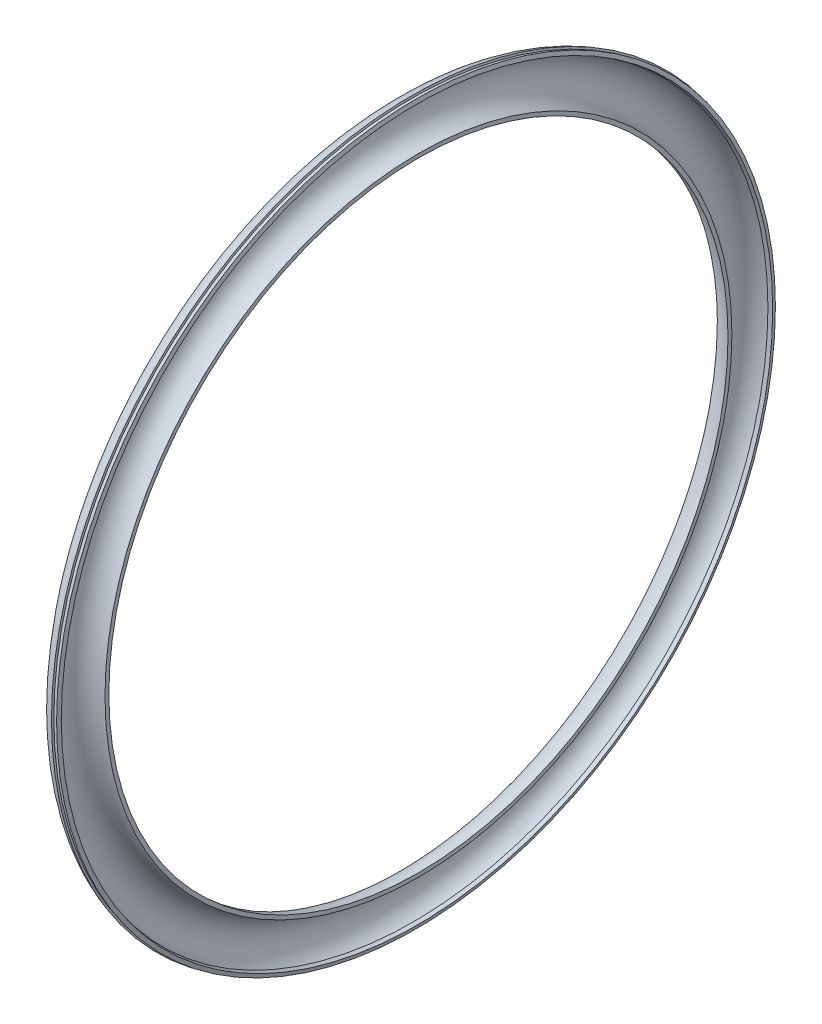
ISO-10303-21;
HEADER;
FILE_DESCRIPTION(('STEP AP214'),'2;1');
FILE_NAME('part.step','',(''),(''),'','','');
FILE_SCHEMA(('AUTOMOTIVE_DESIGN { 1 0 10303 214 1 1 1 1 }'));
ENDSEC;
DATA;
#1=APPLICATION_CONTEXT('core data for automotive mechanical design processes');
#2=APPLICATION_PROTOCOL_DEFINITION('international standard','automotive_design',2000,#1);
#3=PRODUCT_CONTEXT('',#1,'mechanical');
#4=PRODUCT('Part','Part','',(#3));
#5=PRODUCT_RELATED_PRODUCT_CATEGORY('part','',(#4));
#6=PRODUCT_DEFINITION_FORMATION('','',#4);
#7=PRODUCT_DEFINITION_CONTEXT('part definition',#1,'design');
#8=PRODUCT_DEFINITION('design','',#6,#7);
#9=PRODUCT_DEFINITION_SHAPE('','',#8);
#10=(LENGTH_UNIT() NAMED_UNIT(*) SI_UNIT(.MILLI.,.METRE.));
#11=(NAMED_UNIT(*) PLANE_ANGLE_UNIT() SI_UNIT($,.RADIAN.));
#12=(NAMED_UNIT(*) SI_UNIT($,.STERADIAN.) SOLID_ANGLE_UNIT());
#13=UNCERTAINTY_MEASURE_WITH_UNIT(LENGTH_MEASURE(1.E-05),#10,'distance_accuracy_value','');
#14=(GEOMETRIC_REPRESENTATION_CONTEXT(3) GLOBAL_UNCERTAINTY_ASSIGNED_CONTEXT((#13)) GLOBAL_UNIT_ASSIGNED_CONTEXT((#10,
#11,#12)) REPRESENTATION_CONTEXT('',''));
#15=CARTESIAN_POINT('',(0.,0.,0.));
#16=DIRECTION('',(0.,0.,1.));
#17=DIRECTION('',(1.,0.,0.));
#18=AXIS2_PLACEMENT_3D('',#15,#16,#17);
#19=CARTESIAN_POINT('',(0.,0.,0.));
#20=DIRECTION('',(1.,0.,0.));
#21=DIRECTION('',(0.,0.,-1.));
#22=AXIS2_PLACEMENT_3D('',#19,#20,#21);
#23=TOROIDAL_SURFACE('',#22,260.,17.);
#24=CARTESIAN_POINT('',(-4.39992376674275,0.,0.));
#25=DIRECTION('',(1.,0.,0.));
#26=DIRECTION('',(0.,0.,-1.));
#27=AXIS2_PLACEMENT_3D('',#24,#25,#26);
#28=CIRCLE('',#27,276.420739046914);
#29=CARTESIAN_POINT('',(-4.39992376674275,0.,-276.420739046914));
#30=VERTEX_POINT('',#29);
#31=EDGE_CURVE('E10',#30,#30,#28,.T.);
#32=ORIENTED_EDGE('',*,*,#31,.T.);
#33=EDGE_LOOP('',(#32));
#34=FACE_BOUND('',#33,.T.);
#35=CARTESIAN_POINT('',(0.,0.,0.));
#36=DIRECTION('',(1.,0.,0.));
#37=DIRECTION('',(0.,0.,-1.));
#38=AXIS2_PLACEMENT_3D('',#35,#36,#37);
#39=CIRCLE('',#38,243.);
#40=CARTESIAN_POINT('',(0.,0.,-243.));
#41=VERTEX_POINT('',#40);
#42=EDGE_CURVE('E63',#41,#41,#39,.T.);
#43=ORIENTED_EDGE('',*,*,#42,.F.);
#44=EDGE_LOOP('',(#43));
#45=FACE_BOUND('',#44,.T.);
#46=ADVANCED_FACE('F35',(#34,#45),#23,.F.);
#47=CARTESIAN_POINT('',(-4.39992376674275,0.,0.));
#48=DIRECTION('',(-1.,0.,0.));
#49=DIRECTION('',(0.,0.,1.));
#50=AXIS2_PLACEMENT_3D('',#47,#48,#49);
#51=CONICAL_SURFACE('',#50,276.420739046914,1.30899693899575);
#52=CARTESIAN_POINT('',(-4.01169519908898,0.,0.));
#53=DIRECTION('',(1.,0.,0.));
#54=DIRECTION('',(0.,0.,-1.));
#55=AXIS2_PLACEMENT_3D('',#52,#53,#54);
#56=CIRCLE('',#55,274.971850307481);
#57=CARTESIAN_POINT('',(-4.01169519908898,0.,-274.971850307481));
#58=VERTEX_POINT('',#57);
#59=EDGE_CURVE('E41',#58,#58,#56,.T.);
#60=ORIENTED_EDGE('',*,*,#59,.T.);
#61=EDGE_LOOP('',(#60));
#62=FACE_BOUND('',#61,.T.);
#63=ORIENTED_EDGE('',*,*,#31,.F.);
#64=EDGE_LOOP('',(#63));
#65=FACE_BOUND('',#64,.T.);
#66=ADVANCED_FACE('F71',(#62,#65),#51,.F.);
#67=CARTESIAN_POINT('',(-4.01169519908898,0.,0.));
#68=DIRECTION('',(1.,0.,0.));
#69=DIRECTION('',(0.,0.,-1.));
#70=AXIS2_PLACEMENT_3D('',#67,#68,#69);
#71=CONICAL_SURFACE('',#70,274.971850307481,0.261799387799145);
#72=CARTESIAN_POINT('',(-1.11391772022176,0.,0.));
#73=DIRECTION('',(1.,0.,0.));
#74=DIRECTION('',(0.,0.,-1.));
#75=AXIS2_PLACEMENT_3D('',#72,#73,#74);
#76=CIRCLE('',#75,275.748307442788);
#77=CARTESIAN_POINT('',(-1.11391772022176,0.,-275.748307442788));
#78=VERTEX_POINT('',#77);
#79=EDGE_CURVE('E45',#78,#78,#76,.T.);
#80=ORIENTED_EDGE('',*,*,#79,.T.);
#81=EDGE_LOOP('',(#80));
#82=FACE_BOUND('',#81,.T.);
#83=ORIENTED_EDGE('',*,*,#59,.F.);
#84=EDGE_LOOP('',(#83));
#85=FACE_BOUND('',#84,.T.);
#86=ADVANCED_FACE('F75',(#82,#85),#71,.F.);
#87=CARTESIAN_POINT('',(-1.11391772022176,0.,0.));
#88=DIRECTION('',(-1.,0.,0.));
#89=DIRECTION('',(0.,0.,1.));
#90=AXIS2_PLACEMENT_3D('',#87,#88,#89);
#91=CONICAL_SURFACE('',#90,275.748307442788,1.30899693899575);
#92=CARTESIAN_POINT('',(-1.89037485552931,0.,0.));
#93=DIRECTION('',(1.,0.,0.));
#94=DIRECTION('',(0.,0.,-1.));
#95=AXIS2_PLACEMENT_3D('',#92,#93,#94);
#96=CIRCLE('',#95,278.646084921655);
#97=CARTESIAN_POINT('',(-1.89037485552931,0.,-278.646084921655));
#98=VERTEX_POINT('',#97);
#99=EDGE_CURVE('E49',#98,#98,#96,.T.);
#100=ORIENTED_EDGE('',*,*,#99,.T.);
#101=EDGE_LOOP('',(#100));
#102=FACE_BOUND('',#101,.T.);
#103=ORIENTED_EDGE('',*,*,#79,.F.);
#104=EDGE_LOOP('',(#103));
#105=FACE_BOUND('',#104,.T.);
#106=ADVANCED_FACE('F79',(#102,#105),#91,.T.);
#107=CARTESIAN_POINT('',(-1.89037485552931,0.,0.));
#108=DIRECTION('',(1.,0.,0.));
#109=DIRECTION('',(0.,0.,-1.));
#110=AXIS2_PLACEMENT_3D('',#107,#108,#109);
#111=CONICAL_SURFACE('',#110,278.646084921655,0.261799387799145);
#112=CARTESIAN_POINT('',(-4.78815233439653,0.,0.));
#113=DIRECTION('',(1.,0.,0.));
#114=DIRECTION('',(0.,0.,-1.));
#115=AXIS2_PLACEMENT_3D('',#112,#113,#114);
#116=CIRCLE('',#115,277.869627786348);
#117=CARTESIAN_POINT('',(-4.78815233439653,0.,-277.869627786348));
#118=VERTEX_POINT('',#117);
#119=EDGE_CURVE('E54',#118,#118,#116,.T.);
#120=ORIENTED_EDGE('',*,*,#119,.T.);
#121=EDGE_LOOP('',(#120));
#122=FACE_BOUND('',#121,.T.);
#123=ORIENTED_EDGE('',*,*,#99,.F.);
#124=EDGE_LOOP('',(#123));
#125=FACE_BOUND('',#124,.T.);
#126=ADVANCED_FACE('F86',(#122,#125),#111,.T.);
#127=CARTESIAN_POINT('',(-4.78815233439653,0.,0.));
#128=DIRECTION('',(-1.,0.,0.));
#129=DIRECTION('',(0.,0.,1.));
#130=AXIS2_PLACEMENT_3D('',#127,#128,#129);
#131=CONICAL_SURFACE('',#130,277.869627786348,1.30899693899575);
#132=CARTESIAN_POINT('',(-5.1763809020503,0.,0.));
#133=DIRECTION('',(1.,0.,0.));
#134=DIRECTION('',(0.,0.,-1.));
#135=AXIS2_PLACEMENT_3D('',#132,#133,#134);
#136=CIRCLE('',#135,279.318516525781);
#137=CARTESIAN_POINT('',(-5.1763809020503,0.,-279.318516525781));
#138=VERTEX_POINT('',#137);
#139=EDGE_CURVE('E57',#138,#138,#136,.T.);
#140=ORIENTED_EDGE('',*,*,#139,.T.);
#141=EDGE_LOOP('',(#140));
#142=FACE_BOUND('',#141,.T.);
#143=ORIENTED_EDGE('',*,*,#119,.F.);
#144=EDGE_LOOP('',(#143));
#145=FACE_BOUND('',#144,.T.);
#146=ADVANCED_FACE('F90',(#142,#145),#131,.T.);
#147=CARTESIAN_POINT('',(0.,0.,0.));
#148=DIRECTION('',(1.,0.,0.));
#149=DIRECTION('',(0.,0.,-1.));
#150=AXIS2_PLACEMENT_3D('',#147,#148,#149);
#151=TOROIDAL_SURFACE('',#150,260.,20.);
#152=CARTESIAN_POINT('',(0.,0.,0.));
#153=DIRECTION('',(1.,0.,0.));
#154=DIRECTION('',(0.,0.,-1.));
#155=AXIS2_PLACEMENT_3D('',#152,#153,#154);
#156=CIRCLE('',#155,240.);
#157=CARTESIAN_POINT('',(0.,0.,-240.));
#158=VERTEX_POINT('',#157);
#159=EDGE_CURVE('E60',#158,#158,#156,.T.);
#160=ORIENTED_EDGE('',*,*,#159,.T.);
#161=EDGE_LOOP('',(#160));
#162=FACE_BOUND('',#161,.T.);
#163=ORIENTED_EDGE('',*,*,#139,.F.);
#164=EDGE_LOOP('',(#163));
#165=FACE_BOUND('',#164,.T.);
#166=ADVANCED_FACE('F94',(#162,#165),#151,.T.);
#167=CARTESIAN_POINT('',(0.,243.,0.));
#168=DIRECTION('',(1.,0.,0.));
#169=DIRECTION('',(0.,0.,-1.));
#170=AXIS2_PLACEMENT_3D('',#167,#168,#169);
#171=PLANE('',#170);
#172=ORIENTED_EDGE('',*,*,#42,.T.);
#173=EDGE_LOOP('',(#172));
#174=FACE_BOUND('',#173,.T.);
#175=ORIENTED_EDGE('',*,*,#159,.F.);
#176=EDGE_LOOP('',(#175));
#177=FACE_BOUND('',#176,.T.);
#178=ADVANCED_FACE('F67',(#174,#177),#171,.T.);
#179=CLOSED_SHELL('',(#46,#66,#86,#106,#126,#146,#166,#178));
#180=MANIFOLD_SOLID_BREP('B2',#179);
#181=ADVANCED_BREP_SHAPE_REPRESENTATION('',(#18,#180),#14);
#182=SHAPE_DEFINITION_REPRESENTATION(#9,#181);
ENDSEC;
END-ISO-10303-21;
